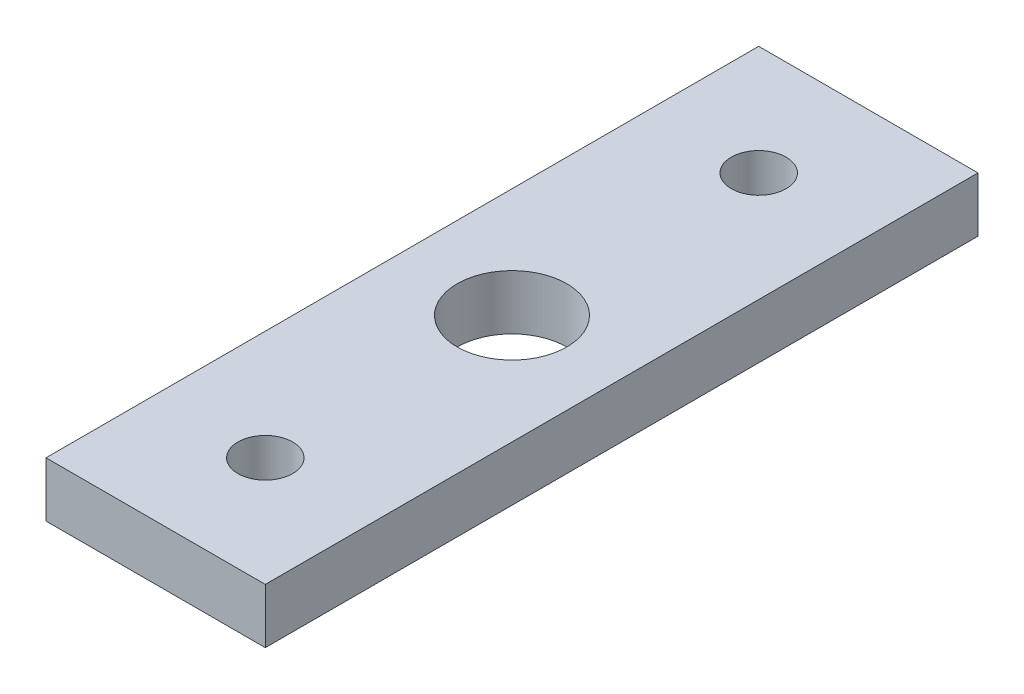
ISO-10303-21;
HEADER;
FILE_DESCRIPTION(('STEP AP214'),'2;1');
FILE_NAME('part.step','',(''),(''),'','','');
FILE_SCHEMA(('AUTOMOTIVE_DESIGN { 1 0 10303 214 1 1 1 1 }'));
ENDSEC;
DATA;
#1=APPLICATION_CONTEXT('core data for automotive mechanical design processes');
#2=APPLICATION_PROTOCOL_DEFINITION('international standard','automotive_design',2000,#1);
#3=PRODUCT_CONTEXT('',#1,'mechanical');
#4=PRODUCT('Part','Part','',(#3));
#5=PRODUCT_RELATED_PRODUCT_CATEGORY('part','',(#4));
#6=PRODUCT_DEFINITION_FORMATION('','',#4);
#7=PRODUCT_DEFINITION_CONTEXT('part definition',#1,'design');
#8=PRODUCT_DEFINITION('design','',#6,#7);
#9=PRODUCT_DEFINITION_SHAPE('','',#8);
#10=(LENGTH_UNIT() NAMED_UNIT(*) SI_UNIT(.MILLI.,.METRE.));
#11=(NAMED_UNIT(*) PLANE_ANGLE_UNIT() SI_UNIT($,.RADIAN.));
#12=(NAMED_UNIT(*) SI_UNIT($,.STERADIAN.) SOLID_ANGLE_UNIT());
#13=UNCERTAINTY_MEASURE_WITH_UNIT(LENGTH_MEASURE(1.E-05),#10,'distance_accuracy_value','');
#14=(GEOMETRIC_REPRESENTATION_CONTEXT(3) GLOBAL_UNCERTAINTY_ASSIGNED_CONTEXT((#13)) GLOBAL_UNIT_ASSIGNED_CONTEXT((#10,
#11,#12)) REPRESENTATION_CONTEXT('',''));
#15=CARTESIAN_POINT('',(0.,0.,0.));
#16=DIRECTION('',(0.,0.,1.));
#17=DIRECTION('',(1.,0.,0.));
#18=AXIS2_PLACEMENT_3D('',#15,#16,#17);
#19=CARTESIAN_POINT('',(0.,6.35,0.));
#20=DIRECTION('',(0.,1.,0.));
#21=DIRECTION('',(0.,0.,1.));
#22=AXIS2_PLACEMENT_3D('',#19,#20,#21);
#23=PLANE('',#22);
#24=CARTESIAN_POINT('',(0.,6.35,-28.575));
#25=DIRECTION('',(0.,1.,0.));
#26=DIRECTION('',(0.,0.,1.));
#27=AXIS2_PLACEMENT_3D('',#24,#25,#26);
#28=CIRCLE('',#27,3.175);
#29=CARTESIAN_POINT('',(0.,6.35,-25.4));
#30=VERTEX_POINT('',#29);
#31=EDGE_CURVE('E134',#30,#30,#28,.T.);
#32=ORIENTED_EDGE('',*,*,#31,.F.);
#33=EDGE_LOOP('',(#32));
#34=FACE_BOUND('',#33,.T.);
#35=DIRECTION('',(0.,0.,-1.));
#36=VECTOR('',#35,1.);
#37=CARTESIAN_POINT('',(12.7,6.35,-41.275));
#38=LINE('',#37,#36);
#39=CARTESIAN_POINT('',(12.7,6.35,41.275));
#40=VERTEX_POINT('',#39);
#41=CARTESIAN_POINT('',(12.7,6.35,-41.275));
#42=VERTEX_POINT('',#41);
#43=EDGE_CURVE('E92',#40,#42,#38,.T.);
#44=ORIENTED_EDGE('',*,*,#43,.T.);
#45=DIRECTION('',(-1.,0.,0.));
#46=VECTOR('',#45,1.);
#47=CARTESIAN_POINT('',(-12.7,6.35,-41.275));
#48=LINE('',#47,#46);
#49=CARTESIAN_POINT('',(-12.7,6.35,-41.275));
#50=VERTEX_POINT('',#49);
#51=EDGE_CURVE('E87',#42,#50,#48,.T.);
#52=ORIENTED_EDGE('',*,*,#51,.T.);
#53=DIRECTION('',(0.,0.,1.));
#54=VECTOR('',#53,1.);
#55=CARTESIAN_POINT('',(-12.7,6.35,-41.275));
#56=LINE('',#55,#54);
#57=CARTESIAN_POINT('',(-12.7,6.35,41.275));
#58=VERTEX_POINT('',#57);
#59=EDGE_CURVE('E90',#50,#58,#56,.T.);
#60=ORIENTED_EDGE('',*,*,#59,.T.);
#61=DIRECTION('',(1.,0.,0.));
#62=VECTOR('',#61,1.);
#63=CARTESIAN_POINT('',(-12.7,6.35,41.275));
#64=LINE('',#63,#62);
#65=EDGE_CURVE('E57',#58,#40,#64,.T.);
#66=ORIENTED_EDGE('',*,*,#65,.T.);
#67=EDGE_LOOP('',(#44,#52,#60,#66));
#68=FACE_BOUND('',#67,.T.);
#69=CARTESIAN_POINT('',(0.,6.35,0.));
#70=DIRECTION('',(0.,1.,0.));
#71=DIRECTION('',(0.,0.,1.));
#72=AXIS2_PLACEMENT_3D('',#69,#70,#71);
#73=CIRCLE('',#72,6.35);
#74=CARTESIAN_POINT('',(0.,6.35,6.35));
#75=VERTEX_POINT('',#74);
#76=EDGE_CURVE('E112',#75,#75,#73,.T.);
#77=ORIENTED_EDGE('',*,*,#76,.F.);
#78=EDGE_LOOP('',(#77));
#79=FACE_BOUND('',#78,.T.);
#80=CARTESIAN_POINT('',(0.,6.35,28.575));
#81=DIRECTION('',(0.,1.,0.));
#82=DIRECTION('',(0.,0.,-1.));
#83=AXIS2_PLACEMENT_3D('',#80,#81,#82);
#84=CIRCLE('',#83,3.17499999999999);
#85=CARTESIAN_POINT('',(0.,6.35,25.4));
#86=VERTEX_POINT('',#85);
#87=EDGE_CURVE('E142',#86,#86,#84,.T.);
#88=ORIENTED_EDGE('',*,*,#87,.F.);
#89=EDGE_LOOP('',(#88));
#90=FACE_BOUND('',#89,.T.);
#91=ADVANCED_FACE('F39',(#34,#68,#79,#90),#23,.T.);
#92=CARTESIAN_POINT('',(0.,0.,0.));
#93=DIRECTION('',(0.,1.,0.));
#94=DIRECTION('',(0.,0.,1.));
#95=AXIS2_PLACEMENT_3D('',#92,#93,#94);
#96=PLANE('',#95);
#97=DIRECTION('',(0.,0.,-1.));
#98=VECTOR('',#97,1.);
#99=CARTESIAN_POINT('',(12.7,0.,-41.275));
#100=LINE('',#99,#98);
#101=CARTESIAN_POINT('',(12.7,0.,41.275));
#102=VERTEX_POINT('',#101);
#103=CARTESIAN_POINT('',(12.7,0.,-41.275));
#104=VERTEX_POINT('',#103);
#105=EDGE_CURVE('E108',#102,#104,#100,.T.);
#106=ORIENTED_EDGE('',*,*,#105,.F.);
#107=DIRECTION('',(1.,0.,0.));
#108=VECTOR('',#107,1.);
#109=CARTESIAN_POINT('',(-12.7,0.,41.275));
#110=LINE('',#109,#108);
#111=CARTESIAN_POINT('',(-12.7,0.,41.275));
#112=VERTEX_POINT('',#111);
#113=EDGE_CURVE('E80',#112,#102,#110,.T.);
#114=ORIENTED_EDGE('',*,*,#113,.F.);
#115=DIRECTION('',(0.,0.,1.));
#116=VECTOR('',#115,1.);
#117=CARTESIAN_POINT('',(-12.7,0.,-41.275));
#118=LINE('',#117,#116);
#119=CARTESIAN_POINT('',(-12.7,0.,-41.275));
#120=VERTEX_POINT('',#119);
#121=EDGE_CURVE('E74',#120,#112,#118,.T.);
#122=ORIENTED_EDGE('',*,*,#121,.F.);
#123=DIRECTION('',(-1.,0.,0.));
#124=VECTOR('',#123,1.);
#125=CARTESIAN_POINT('',(-12.7,0.,-41.275));
#126=LINE('',#125,#124);
#127=EDGE_CURVE('E97',#104,#120,#126,.T.);
#128=ORIENTED_EDGE('',*,*,#127,.F.);
#129=EDGE_LOOP('',(#106,#114,#122,#128));
#130=FACE_BOUND('',#129,.T.);
#131=CARTESIAN_POINT('',(0.,0.,0.));
#132=DIRECTION('',(0.,1.,0.));
#133=DIRECTION('',(0.,0.,1.));
#134=AXIS2_PLACEMENT_3D('',#131,#132,#133);
#135=CIRCLE('',#134,6.35);
#136=CARTESIAN_POINT('',(0.,0.,6.35));
#137=VERTEX_POINT('',#136);
#138=EDGE_CURVE('E130',#137,#137,#135,.T.);
#139=ORIENTED_EDGE('',*,*,#138,.T.);
#140=EDGE_LOOP('',(#139));
#141=FACE_BOUND('',#140,.T.);
#142=CARTESIAN_POINT('',(0.,0.,-28.575));
#143=DIRECTION('',(0.,1.,0.));
#144=DIRECTION('',(0.,0.,1.));
#145=AXIS2_PLACEMENT_3D('',#142,#143,#144);
#146=CIRCLE('',#145,3.175);
#147=CARTESIAN_POINT('',(0.,0.,-25.4));
#148=VERTEX_POINT('',#147);
#149=EDGE_CURVE('E138',#148,#148,#146,.T.);
#150=ORIENTED_EDGE('',*,*,#149,.T.);
#151=EDGE_LOOP('',(#150));
#152=FACE_BOUND('',#151,.T.);
#153=CARTESIAN_POINT('',(0.,0.,28.575));
#154=DIRECTION('',(0.,1.,0.));
#155=DIRECTION('',(0.,0.,-1.));
#156=AXIS2_PLACEMENT_3D('',#153,#154,#155);
#157=CIRCLE('',#156,3.17499999999999);
#158=CARTESIAN_POINT('',(0.,0.,25.4));
#159=VERTEX_POINT('',#158);
#160=EDGE_CURVE('E146',#159,#159,#157,.T.);
#161=ORIENTED_EDGE('',*,*,#160,.T.);
#162=EDGE_LOOP('',(#161));
#163=FACE_BOUND('',#162,.T.);
#164=ADVANCED_FACE('F125',(#130,#141,#152,#163),#96,.F.);
#165=CARTESIAN_POINT('',(12.7,6.35,-41.275));
#166=DIRECTION('',(-1.,0.,0.));
#167=DIRECTION('',(0.,0.,1.));
#168=AXIS2_PLACEMENT_3D('',#165,#166,#167);
#169=PLANE('',#168);
#170=ORIENTED_EDGE('',*,*,#105,.T.);
#171=DIRECTION('',(0.,-1.,0.));
#172=VECTOR('',#171,1.);
#173=CARTESIAN_POINT('',(12.7,6.35,-41.275));
#174=LINE('',#173,#172);
#175=EDGE_CURVE('E11',#42,#104,#174,.T.);
#176=ORIENTED_EDGE('',*,*,#175,.F.);
#177=ORIENTED_EDGE('',*,*,#43,.F.);
#178=DIRECTION('',(0.,-1.,0.));
#179=VECTOR('',#178,1.);
#180=CARTESIAN_POINT('',(12.7,6.35,41.275));
#181=LINE('',#180,#179);
#182=EDGE_CURVE('E104',#40,#102,#181,.T.);
#183=ORIENTED_EDGE('',*,*,#182,.T.);
#184=EDGE_LOOP('',(#170,#176,#177,#183));
#185=FACE_BOUND('',#184,.T.);
#186=ADVANCED_FACE('F41',(#185),#169,.F.);
#187=CARTESIAN_POINT('',(-12.7,6.35,-41.275));
#188=DIRECTION('',(0.,0.,1.));
#189=DIRECTION('',(1.,0.,0.));
#190=AXIS2_PLACEMENT_3D('',#187,#188,#189);
#191=PLANE('',#190);
#192=ORIENTED_EDGE('',*,*,#127,.T.);
#193=DIRECTION('',(0.,-1.,0.));
#194=VECTOR('',#193,1.);
#195=CARTESIAN_POINT('',(-12.7,6.35,-41.275));
#196=LINE('',#195,#194);
#197=EDGE_CURVE('E49',#50,#120,#196,.T.);
#198=ORIENTED_EDGE('',*,*,#197,.F.);
#199=ORIENTED_EDGE('',*,*,#51,.F.);
#200=ORIENTED_EDGE('',*,*,#175,.T.);
#201=EDGE_LOOP('',(#192,#198,#199,#200));
#202=FACE_BOUND('',#201,.T.);
#203=ADVANCED_FACE('F96',(#202),#191,.F.);
#204=CARTESIAN_POINT('',(-12.7,6.35,-41.275));
#205=DIRECTION('',(1.,0.,0.));
#206=DIRECTION('',(0.,0.,-1.));
#207=AXIS2_PLACEMENT_3D('',#204,#205,#206);
#208=PLANE('',#207);
#209=ORIENTED_EDGE('',*,*,#121,.T.);
#210=DIRECTION('',(0.,-1.,0.));
#211=VECTOR('',#210,1.);
#212=CARTESIAN_POINT('',(-12.7,6.35,41.275));
#213=LINE('',#212,#211);
#214=EDGE_CURVE('E99',#58,#112,#213,.T.);
#215=ORIENTED_EDGE('',*,*,#214,.F.);
#216=ORIENTED_EDGE('',*,*,#59,.F.);
#217=ORIENTED_EDGE('',*,*,#197,.T.);
#218=EDGE_LOOP('',(#209,#215,#216,#217));
#219=FACE_BOUND('',#218,.T.);
#220=ADVANCED_FACE('F100',(#219),#208,.F.);
#221=CARTESIAN_POINT('',(-12.7,6.35,41.275));
#222=DIRECTION('',(0.,0.,-1.));
#223=DIRECTION('',(-1.,0.,0.));
#224=AXIS2_PLACEMENT_3D('',#221,#222,#223);
#225=PLANE('',#224);
#226=ORIENTED_EDGE('',*,*,#113,.T.);
#227=ORIENTED_EDGE('',*,*,#182,.F.);
#228=ORIENTED_EDGE('',*,*,#65,.F.);
#229=ORIENTED_EDGE('',*,*,#214,.T.);
#230=EDGE_LOOP('',(#226,#227,#228,#229));
#231=FACE_BOUND('',#230,.T.);
#232=ADVANCED_FACE('F122',(#231),#225,.F.);
#233=CARTESIAN_POINT('',(0.,6.35,0.));
#234=DIRECTION('',(0.,-1.,0.));
#235=DIRECTION('',(0.,0.,-1.));
#236=AXIS2_PLACEMENT_3D('',#233,#234,#235);
#237=CYLINDRICAL_SURFACE('',#236,6.35);
#238=ORIENTED_EDGE('',*,*,#76,.T.);
#239=EDGE_LOOP('',(#238));
#240=FACE_BOUND('',#239,.T.);
#241=ORIENTED_EDGE('',*,*,#138,.F.);
#242=EDGE_LOOP('',(#241));
#243=FACE_BOUND('',#242,.T.);
#244=ADVANCED_FACE('F166',(#240,#243),#237,.F.);
#245=CARTESIAN_POINT('',(0.,6.35,-28.575));
#246=DIRECTION('',(0.,-1.,0.));
#247=DIRECTION('',(0.,0.,-1.));
#248=AXIS2_PLACEMENT_3D('',#245,#246,#247);
#249=CYLINDRICAL_SURFACE('',#248,3.175);
#250=ORIENTED_EDGE('',*,*,#31,.T.);
#251=EDGE_LOOP('',(#250));
#252=FACE_BOUND('',#251,.T.);
#253=ORIENTED_EDGE('',*,*,#149,.F.);
#254=EDGE_LOOP('',(#253));
#255=FACE_BOUND('',#254,.T.);
#256=ADVANCED_FACE('F212',(#252,#255),#249,.F.);
#257=CARTESIAN_POINT('',(0.,6.35,28.575));
#258=DIRECTION('',(0.,-1.,0.));
#259=DIRECTION('',(0.,0.,-1.));
#260=AXIS2_PLACEMENT_3D('',#257,#258,#259);
#261=CYLINDRICAL_SURFACE('',#260,3.17499999999999);
#262=ORIENTED_EDGE('',*,*,#87,.T.);
#263=EDGE_LOOP('',(#262));
#264=FACE_BOUND('',#263,.T.);
#265=ORIENTED_EDGE('',*,*,#160,.F.);
#266=EDGE_LOOP('',(#265));
#267=FACE_BOUND('',#266,.T.);
#268=ADVANCED_FACE('F154',(#264,#267),#261,.F.);
#269=CLOSED_SHELL('',(#91,#164,#186,#203,#220,#232,#244,#256,#268));
#270=MANIFOLD_SOLID_BREP('B2',#269);
#271=ADVANCED_BREP_SHAPE_REPRESENTATION('',(#18,#270),#14);
#272=SHAPE_DEFINITION_REPRESENTATION(#9,#271);
ENDSEC;
END-ISO-10303-21;
